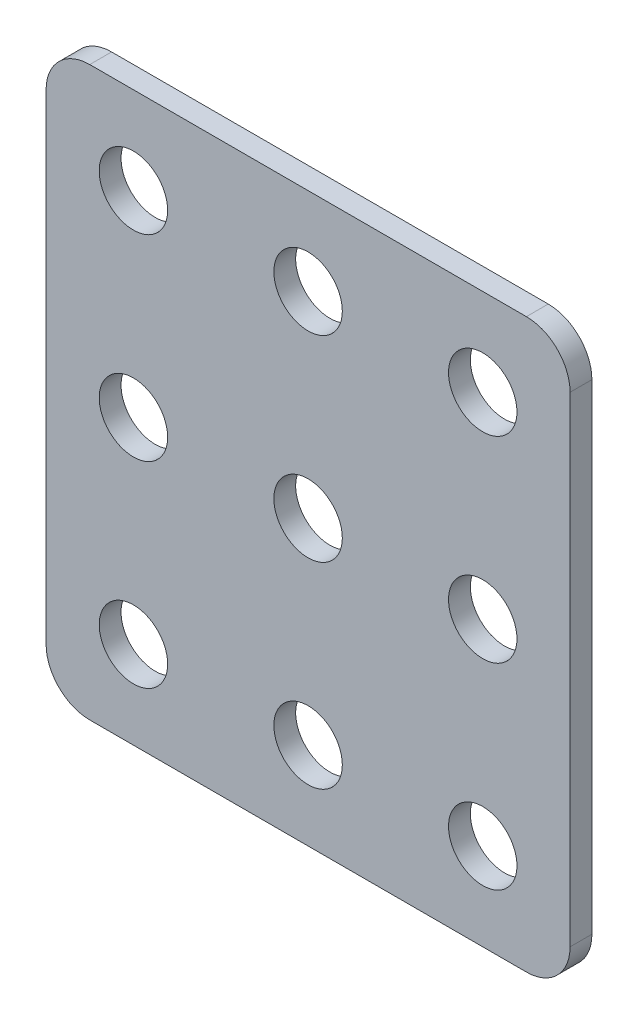
ISO-10303-21;
HEADER;
FILE_DESCRIPTION(('STEP AP214'),'2;1');
FILE_NAME('part.step','',(''),(''),'','','');
FILE_SCHEMA(('AUTOMOTIVE_DESIGN { 1 0 10303 214 1 1 1 1 }'));
ENDSEC;
DATA;
#1=APPLICATION_CONTEXT('core data for automotive mechanical design processes');
#2=APPLICATION_PROTOCOL_DEFINITION('international standard','automotive_design',2000,#1);
#3=PRODUCT_CONTEXT('',#1,'mechanical');
#4=PRODUCT('Part','Part','',(#3));
#5=PRODUCT_RELATED_PRODUCT_CATEGORY('part','',(#4));
#6=PRODUCT_DEFINITION_FORMATION('','',#4);
#7=PRODUCT_DEFINITION_CONTEXT('part definition',#1,'design');
#8=PRODUCT_DEFINITION('design','',#6,#7);
#9=PRODUCT_DEFINITION_SHAPE('','',#8);
#10=(LENGTH_UNIT() NAMED_UNIT(*) SI_UNIT(.MILLI.,.METRE.));
#11=(NAMED_UNIT(*) PLANE_ANGLE_UNIT() SI_UNIT($,.RADIAN.));
#12=(NAMED_UNIT(*) SI_UNIT($,.STERADIAN.) SOLID_ANGLE_UNIT());
#13=UNCERTAINTY_MEASURE_WITH_UNIT(LENGTH_MEASURE(1.E-05),#10,'distance_accuracy_value','');
#14=(GEOMETRIC_REPRESENTATION_CONTEXT(3) GLOBAL_UNCERTAINTY_ASSIGNED_CONTEXT((#13)) GLOBAL_UNIT_ASSIGNED_CONTEXT((#10,
#11,#12)) REPRESENTATION_CONTEXT('',''));
#15=CARTESIAN_POINT('',(0.,0.,0.));
#16=DIRECTION('',(0.,0.,1.));
#17=DIRECTION('',(1.,0.,0.));
#18=AXIS2_PLACEMENT_3D('',#15,#16,#17);
#19=CARTESIAN_POINT('',(31.75,34.925,0.79375));
#20=DIRECTION('',(0.,0.,-1.));
#21=DIRECTION('',(-1.,0.,0.));
#22=AXIS2_PLACEMENT_3D('',#19,#20,#21);
#23=CYLINDRICAL_SURFACE('',#22,2.4892);
#24=CARTESIAN_POINT('',(31.75,34.925,0.79375));
#25=DIRECTION('',(0.,0.,1.));
#26=DIRECTION('',(1.,0.,0.));
#27=AXIS2_PLACEMENT_3D('',#24,#25,#26);
#28=CIRCLE('',#27,2.4892);
#29=CARTESIAN_POINT('',(34.2392,34.925,0.79375));
#30=VERTEX_POINT('',#29);
#31=EDGE_CURVE('E185',#30,#30,#28,.T.);
#32=ORIENTED_EDGE('',*,*,#31,.T.);
#33=EDGE_LOOP('',(#32));
#34=FACE_BOUND('',#33,.T.);
#35=CARTESIAN_POINT('',(31.75,34.925,-0.79375));
#36=DIRECTION('',(0.,0.,1.));
#37=DIRECTION('',(1.,0.,0.));
#38=AXIS2_PLACEMENT_3D('',#35,#36,#37);
#39=CIRCLE('',#38,2.4892);
#40=CARTESIAN_POINT('',(34.2392,34.925,-0.79375));
#41=VERTEX_POINT('',#40);
#42=EDGE_CURVE('E188',#41,#41,#39,.T.);
#43=ORIENTED_EDGE('',*,*,#42,.F.);
#44=EDGE_LOOP('',(#43));
#45=FACE_BOUND('',#44,.T.);
#46=ADVANCED_FACE('F33',(#34,#45),#23,.F.);
#47=CARTESIAN_POINT('',(31.75,20.6375,0.79375));
#48=DIRECTION('',(0.,0.,-1.));
#49=DIRECTION('',(-1.,0.,0.));
#50=AXIS2_PLACEMENT_3D('',#47,#48,#49);
#51=CYLINDRICAL_SURFACE('',#50,2.4892);
#52=CARTESIAN_POINT('',(31.75,20.6375,0.79375));
#53=DIRECTION('',(0.,0.,1.));
#54=DIRECTION('',(1.,0.,0.));
#55=AXIS2_PLACEMENT_3D('',#52,#53,#54);
#56=CIRCLE('',#55,2.4892);
#57=CARTESIAN_POINT('',(34.2392,20.6375,0.79375));
#58=VERTEX_POINT('',#57);
#59=EDGE_CURVE('E179',#58,#58,#56,.T.);
#60=ORIENTED_EDGE('',*,*,#59,.T.);
#61=EDGE_LOOP('',(#60));
#62=FACE_BOUND('',#61,.T.);
#63=CARTESIAN_POINT('',(31.75,20.6375,-0.79375));
#64=DIRECTION('',(0.,0.,1.));
#65=DIRECTION('',(1.,0.,0.));
#66=AXIS2_PLACEMENT_3D('',#63,#64,#65);
#67=CIRCLE('',#66,2.4892);
#68=CARTESIAN_POINT('',(34.2392,20.6375,-0.79375));
#69=VERTEX_POINT('',#68);
#70=EDGE_CURVE('E182',#69,#69,#67,.T.);
#71=ORIENTED_EDGE('',*,*,#70,.F.);
#72=EDGE_LOOP('',(#71));
#73=FACE_BOUND('',#72,.T.);
#74=ADVANCED_FACE('F245',(#62,#73),#51,.F.);
#75=CARTESIAN_POINT('',(31.75,6.35,0.79375));
#76=DIRECTION('',(0.,0.,-1.));
#77=DIRECTION('',(-1.,0.,0.));
#78=AXIS2_PLACEMENT_3D('',#75,#76,#77);
#79=CYLINDRICAL_SURFACE('',#78,2.4892);
#80=CARTESIAN_POINT('',(31.75,6.35,0.79375));
#81=DIRECTION('',(0.,0.,1.));
#82=DIRECTION('',(1.,0.,0.));
#83=AXIS2_PLACEMENT_3D('',#80,#81,#82);
#84=CIRCLE('',#83,2.4892);
#85=CARTESIAN_POINT('',(34.2392,6.35,0.79375));
#86=VERTEX_POINT('',#85);
#87=EDGE_CURVE('E173',#86,#86,#84,.T.);
#88=ORIENTED_EDGE('',*,*,#87,.T.);
#89=EDGE_LOOP('',(#88));
#90=FACE_BOUND('',#89,.T.);
#91=CARTESIAN_POINT('',(31.75,6.35,-0.79375));
#92=DIRECTION('',(0.,0.,1.));
#93=DIRECTION('',(1.,0.,0.));
#94=AXIS2_PLACEMENT_3D('',#91,#92,#93);
#95=CIRCLE('',#94,2.4892);
#96=CARTESIAN_POINT('',(34.2392,6.35,-0.79375));
#97=VERTEX_POINT('',#96);
#98=EDGE_CURVE('E176',#97,#97,#95,.T.);
#99=ORIENTED_EDGE('',*,*,#98,.F.);
#100=EDGE_LOOP('',(#99));
#101=FACE_BOUND('',#100,.T.);
#102=ADVANCED_FACE('F251',(#90,#101),#79,.F.);
#103=CARTESIAN_POINT('',(19.05,34.925,0.79375));
#104=DIRECTION('',(0.,0.,-1.));
#105=DIRECTION('',(-1.,0.,0.));
#106=AXIS2_PLACEMENT_3D('',#103,#104,#105);
#107=CYLINDRICAL_SURFACE('',#106,2.4892);
#108=CARTESIAN_POINT('',(19.05,34.925,0.79375));
#109=DIRECTION('',(0.,0.,1.));
#110=DIRECTION('',(1.,0.,0.));
#111=AXIS2_PLACEMENT_3D('',#108,#109,#110);
#112=CIRCLE('',#111,2.4892);
#113=CARTESIAN_POINT('',(21.5392,34.925,0.79375));
#114=VERTEX_POINT('',#113);
#115=EDGE_CURVE('E167',#114,#114,#112,.T.);
#116=ORIENTED_EDGE('',*,*,#115,.T.);
#117=EDGE_LOOP('',(#116));
#118=FACE_BOUND('',#117,.T.);
#119=CARTESIAN_POINT('',(19.05,34.925,-0.79375));
#120=DIRECTION('',(0.,0.,1.));
#121=DIRECTION('',(1.,0.,0.));
#122=AXIS2_PLACEMENT_3D('',#119,#120,#121);
#123=CIRCLE('',#122,2.4892);
#124=CARTESIAN_POINT('',(21.5392,34.925,-0.79375));
#125=VERTEX_POINT('',#124);
#126=EDGE_CURVE('E170',#125,#125,#123,.T.);
#127=ORIENTED_EDGE('',*,*,#126,.F.);
#128=EDGE_LOOP('',(#127));
#129=FACE_BOUND('',#128,.T.);
#130=ADVANCED_FACE('F300',(#118,#129),#107,.F.);
#131=CARTESIAN_POINT('',(19.05,20.6375,0.79375));
#132=DIRECTION('',(0.,0.,-1.));
#133=DIRECTION('',(-1.,0.,0.));
#134=AXIS2_PLACEMENT_3D('',#131,#132,#133);
#135=CYLINDRICAL_SURFACE('',#134,2.4892);
#136=CARTESIAN_POINT('',(19.05,20.6375,0.79375));
#137=DIRECTION('',(0.,0.,1.));
#138=DIRECTION('',(1.,0.,0.));
#139=AXIS2_PLACEMENT_3D('',#136,#137,#138);
#140=CIRCLE('',#139,2.4892);
#141=CARTESIAN_POINT('',(21.5392,20.6375,0.79375));
#142=VERTEX_POINT('',#141);
#143=EDGE_CURVE('E161',#142,#142,#140,.T.);
#144=ORIENTED_EDGE('',*,*,#143,.T.);
#145=EDGE_LOOP('',(#144));
#146=FACE_BOUND('',#145,.T.);
#147=CARTESIAN_POINT('',(19.05,20.6375,-0.79375));
#148=DIRECTION('',(0.,0.,1.));
#149=DIRECTION('',(1.,0.,0.));
#150=AXIS2_PLACEMENT_3D('',#147,#148,#149);
#151=CIRCLE('',#150,2.4892);
#152=CARTESIAN_POINT('',(21.5392,20.6375,-0.79375));
#153=VERTEX_POINT('',#152);
#154=EDGE_CURVE('E164',#153,#153,#151,.T.);
#155=ORIENTED_EDGE('',*,*,#154,.F.);
#156=EDGE_LOOP('',(#155));
#157=FACE_BOUND('',#156,.T.);
#158=ADVANCED_FACE('F296',(#146,#157),#135,.F.);
#159=CARTESIAN_POINT('',(19.05,6.35,0.79375));
#160=DIRECTION('',(0.,0.,-1.));
#161=DIRECTION('',(-1.,0.,0.));
#162=AXIS2_PLACEMENT_3D('',#159,#160,#161);
#163=CYLINDRICAL_SURFACE('',#162,2.4892);
#164=CARTESIAN_POINT('',(19.05,6.35,0.79375));
#165=DIRECTION('',(0.,0.,1.));
#166=DIRECTION('',(1.,0.,0.));
#167=AXIS2_PLACEMENT_3D('',#164,#165,#166);
#168=CIRCLE('',#167,2.4892);
#169=CARTESIAN_POINT('',(21.5392,6.35,0.79375));
#170=VERTEX_POINT('',#169);
#171=EDGE_CURVE('E155',#170,#170,#168,.T.);
#172=ORIENTED_EDGE('',*,*,#171,.T.);
#173=EDGE_LOOP('',(#172));
#174=FACE_BOUND('',#173,.T.);
#175=CARTESIAN_POINT('',(19.05,6.35,-0.79375));
#176=DIRECTION('',(0.,0.,1.));
#177=DIRECTION('',(1.,0.,0.));
#178=AXIS2_PLACEMENT_3D('',#175,#176,#177);
#179=CIRCLE('',#178,2.4892);
#180=CARTESIAN_POINT('',(21.5392,6.35,-0.79375));
#181=VERTEX_POINT('',#180);
#182=EDGE_CURVE('E158',#181,#181,#179,.T.);
#183=ORIENTED_EDGE('',*,*,#182,.F.);
#184=EDGE_LOOP('',(#183));
#185=FACE_BOUND('',#184,.T.);
#186=ADVANCED_FACE('F292',(#174,#185),#163,.F.);
#187=CARTESIAN_POINT('',(6.35,34.925,0.79375));
#188=DIRECTION('',(0.,0.,-1.));
#189=DIRECTION('',(-1.,0.,0.));
#190=AXIS2_PLACEMENT_3D('',#187,#188,#189);
#191=CYLINDRICAL_SURFACE('',#190,2.4892);
#192=CARTESIAN_POINT('',(6.35,34.925,0.79375));
#193=DIRECTION('',(0.,0.,1.));
#194=DIRECTION('',(1.,0.,0.));
#195=AXIS2_PLACEMENT_3D('',#192,#193,#194);
#196=CIRCLE('',#195,2.4892);
#197=CARTESIAN_POINT('',(8.8392,34.925,0.79375));
#198=VERTEX_POINT('',#197);
#199=EDGE_CURVE('E149',#198,#198,#196,.T.);
#200=ORIENTED_EDGE('',*,*,#199,.T.);
#201=EDGE_LOOP('',(#200));
#202=FACE_BOUND('',#201,.T.);
#203=CARTESIAN_POINT('',(6.35,34.925,-0.79375));
#204=DIRECTION('',(0.,0.,1.));
#205=DIRECTION('',(1.,0.,0.));
#206=AXIS2_PLACEMENT_3D('',#203,#204,#205);
#207=CIRCLE('',#206,2.4892);
#208=CARTESIAN_POINT('',(8.8392,34.925,-0.79375));
#209=VERTEX_POINT('',#208);
#210=EDGE_CURVE('E152',#209,#209,#207,.T.);
#211=ORIENTED_EDGE('',*,*,#210,.F.);
#212=EDGE_LOOP('',(#211));
#213=FACE_BOUND('',#212,.T.);
#214=ADVANCED_FACE('F278',(#202,#213),#191,.F.);
#215=CARTESIAN_POINT('',(6.35,20.6375,0.79375));
#216=DIRECTION('',(0.,0.,-1.));
#217=DIRECTION('',(-1.,0.,0.));
#218=AXIS2_PLACEMENT_3D('',#215,#216,#217);
#219=CYLINDRICAL_SURFACE('',#218,2.4892);
#220=CARTESIAN_POINT('',(6.35,20.6375,0.79375));
#221=DIRECTION('',(0.,0.,1.));
#222=DIRECTION('',(1.,0.,0.));
#223=AXIS2_PLACEMENT_3D('',#220,#221,#222);
#224=CIRCLE('',#223,2.4892);
#225=CARTESIAN_POINT('',(8.8392,20.6375,0.79375));
#226=VERTEX_POINT('',#225);
#227=EDGE_CURVE('E143',#226,#226,#224,.T.);
#228=ORIENTED_EDGE('',*,*,#227,.T.);
#229=EDGE_LOOP('',(#228));
#230=FACE_BOUND('',#229,.T.);
#231=CARTESIAN_POINT('',(6.35,20.6375,-0.79375));
#232=DIRECTION('',(0.,0.,1.));
#233=DIRECTION('',(1.,0.,0.));
#234=AXIS2_PLACEMENT_3D('',#231,#232,#233);
#235=CIRCLE('',#234,2.4892);
#236=CARTESIAN_POINT('',(8.8392,20.6375,-0.79375));
#237=VERTEX_POINT('',#236);
#238=EDGE_CURVE('E146',#237,#237,#235,.T.);
#239=ORIENTED_EDGE('',*,*,#238,.F.);
#240=EDGE_LOOP('',(#239));
#241=FACE_BOUND('',#240,.T.);
#242=ADVANCED_FACE('F269',(#230,#241),#219,.F.);
#243=CARTESIAN_POINT('',(0.,0.,0.79375));
#244=DIRECTION('',(0.,0.,-1.));
#245=DIRECTION('',(-1.,0.,0.));
#246=AXIS2_PLACEMENT_3D('',#243,#244,#245);
#247=PLANE('',#246);
#248=ORIENTED_EDGE('',*,*,#31,.F.);
#249=EDGE_LOOP('',(#248));
#250=FACE_BOUND('',#249,.T.);
#251=ORIENTED_EDGE('',*,*,#59,.F.);
#252=EDGE_LOOP('',(#251));
#253=FACE_BOUND('',#252,.T.);
#254=ORIENTED_EDGE('',*,*,#87,.F.);
#255=EDGE_LOOP('',(#254));
#256=FACE_BOUND('',#255,.T.);
#257=ORIENTED_EDGE('',*,*,#115,.F.);
#258=EDGE_LOOP('',(#257));
#259=FACE_BOUND('',#258,.T.);
#260=ORIENTED_EDGE('',*,*,#143,.F.);
#261=EDGE_LOOP('',(#260));
#262=FACE_BOUND('',#261,.T.);
#263=ORIENTED_EDGE('',*,*,#171,.F.);
#264=EDGE_LOOP('',(#263));
#265=FACE_BOUND('',#264,.T.);
#266=ORIENTED_EDGE('',*,*,#199,.F.);
#267=EDGE_LOOP('',(#266));
#268=FACE_BOUND('',#267,.T.);
#269=ORIENTED_EDGE('',*,*,#227,.F.);
#270=EDGE_LOOP('',(#269));
#271=FACE_BOUND('',#270,.T.);
#272=DIRECTION('',(-1.,0.,0.));
#273=VECTOR('',#272,1.);
#274=CARTESIAN_POINT('',(0.,41.275,0.79375));
#275=LINE('',#274,#273);
#276=CARTESIAN_POINT('',(34.925,41.275,0.79375));
#277=VERTEX_POINT('',#276);
#278=CARTESIAN_POINT('',(3.175,41.275,0.79375));
#279=VERTEX_POINT('',#278);
#280=EDGE_CURVE('E137',#277,#279,#275,.T.);
#281=ORIENTED_EDGE('',*,*,#280,.T.);
#282=CARTESIAN_POINT('',(3.175,38.1,0.79375));
#283=DIRECTION('',(0.,0.,-1.));
#284=DIRECTION('',(-1.,0.,0.));
#285=AXIS2_PLACEMENT_3D('',#282,#283,#284);
#286=CIRCLE('',#285,3.175);
#287=CARTESIAN_POINT('',(0.,38.1,0.79375));
#288=VERTEX_POINT('',#287);
#289=EDGE_CURVE('E203',#279,#288,#286,.F.);
#290=ORIENTED_EDGE('',*,*,#289,.T.);
#291=DIRECTION('',(0.,-1.,0.));
#292=VECTOR('',#291,1.);
#293=CARTESIAN_POINT('',(0.,0.,0.79375));
#294=LINE('',#293,#292);
#295=CARTESIAN_POINT('',(0.,3.175,0.79375));
#296=VERTEX_POINT('',#295);
#297=EDGE_CURVE('E119',#288,#296,#294,.T.);
#298=ORIENTED_EDGE('',*,*,#297,.T.);
#299=CARTESIAN_POINT('',(3.175,3.175,0.79375));
#300=DIRECTION('',(0.,0.,-1.));
#301=DIRECTION('',(-1.,0.,0.));
#302=AXIS2_PLACEMENT_3D('',#299,#300,#301);
#303=CIRCLE('',#302,3.175);
#304=CARTESIAN_POINT('',(3.175,0.,0.79375));
#305=VERTEX_POINT('',#304);
#306=EDGE_CURVE('E200',#296,#305,#303,.F.);
#307=ORIENTED_EDGE('',*,*,#306,.T.);
#308=DIRECTION('',(1.,0.,0.));
#309=VECTOR('',#308,1.);
#310=CARTESIAN_POINT('',(0.,0.,0.79375));
#311=LINE('',#310,#309);
#312=CARTESIAN_POINT('',(34.925,0.,0.79375));
#313=VERTEX_POINT('',#312);
#314=EDGE_CURVE('E214',#305,#313,#311,.T.);
#315=ORIENTED_EDGE('',*,*,#314,.T.);
#316=CARTESIAN_POINT('',(34.925,3.175,0.79375));
#317=DIRECTION('',(0.,0.,-1.));
#318=DIRECTION('',(-1.,0.,0.));
#319=AXIS2_PLACEMENT_3D('',#316,#317,#318);
#320=CIRCLE('',#319,3.175);
#321=CARTESIAN_POINT('',(38.1,3.175,0.79375));
#322=VERTEX_POINT('',#321);
#323=EDGE_CURVE('E55',#313,#322,#320,.F.);
#324=ORIENTED_EDGE('',*,*,#323,.T.);
#325=DIRECTION('',(0.,1.,0.));
#326=VECTOR('',#325,1.);
#327=CARTESIAN_POINT('',(38.1,0.,0.79375));
#328=LINE('',#327,#326);
#329=CARTESIAN_POINT('',(38.1,38.1,0.79375));
#330=VERTEX_POINT('',#329);
#331=EDGE_CURVE('E222',#322,#330,#328,.T.);
#332=ORIENTED_EDGE('',*,*,#331,.T.);
#333=CARTESIAN_POINT('',(34.925,38.1,0.79375));
#334=DIRECTION('',(0.,0.,-1.));
#335=DIRECTION('',(-1.,0.,0.));
#336=AXIS2_PLACEMENT_3D('',#333,#334,#335);
#337=CIRCLE('',#336,3.175);
#338=EDGE_CURVE('E198',#330,#277,#337,.F.);
#339=ORIENTED_EDGE('',*,*,#338,.T.);
#340=EDGE_LOOP('',(#281,#290,#298,#307,#315,#324,#332,#339));
#341=FACE_BOUND('',#340,.T.);
#342=CARTESIAN_POINT('',(6.35,6.35,0.79375));
#343=DIRECTION('',(0.,0.,1.));
#344=DIRECTION('',(1.,0.,0.));
#345=AXIS2_PLACEMENT_3D('',#342,#343,#344);
#346=CIRCLE('',#345,2.4892);
#347=CARTESIAN_POINT('',(8.8392,6.35,0.79375));
#348=VERTEX_POINT('',#347);
#349=EDGE_CURVE('E128',#348,#348,#346,.T.);
#350=ORIENTED_EDGE('',*,*,#349,.F.);
#351=EDGE_LOOP('',(#350));
#352=FACE_BOUND('',#351,.T.);
#353=ADVANCED_FACE('F264',(#250,#253,#256,#259,#262,#265,#268,#271,#341,#352),#247,.F.);
#354=CARTESIAN_POINT('',(0.,0.,-0.79375));
#355=DIRECTION('',(0.,0.,-1.));
#356=DIRECTION('',(-1.,0.,0.));
#357=AXIS2_PLACEMENT_3D('',#354,#355,#356);
#358=PLANE('',#357);
#359=ORIENTED_EDGE('',*,*,#42,.T.);
#360=EDGE_LOOP('',(#359));
#361=FACE_BOUND('',#360,.T.);
#362=ORIENTED_EDGE('',*,*,#70,.T.);
#363=EDGE_LOOP('',(#362));
#364=FACE_BOUND('',#363,.T.);
#365=ORIENTED_EDGE('',*,*,#98,.T.);
#366=EDGE_LOOP('',(#365));
#367=FACE_BOUND('',#366,.T.);
#368=ORIENTED_EDGE('',*,*,#126,.T.);
#369=EDGE_LOOP('',(#368));
#370=FACE_BOUND('',#369,.T.);
#371=ORIENTED_EDGE('',*,*,#154,.T.);
#372=EDGE_LOOP('',(#371));
#373=FACE_BOUND('',#372,.T.);
#374=ORIENTED_EDGE('',*,*,#182,.T.);
#375=EDGE_LOOP('',(#374));
#376=FACE_BOUND('',#375,.T.);
#377=ORIENTED_EDGE('',*,*,#210,.T.);
#378=EDGE_LOOP('',(#377));
#379=FACE_BOUND('',#378,.T.);
#380=ORIENTED_EDGE('',*,*,#238,.T.);
#381=EDGE_LOOP('',(#380));
#382=FACE_BOUND('',#381,.T.);
#383=DIRECTION('',(0.,-1.,0.));
#384=VECTOR('',#383,1.);
#385=CARTESIAN_POINT('',(0.,0.,-0.79375));
#386=LINE('',#385,#384);
#387=CARTESIAN_POINT('',(0.,38.1,-0.79375));
#388=VERTEX_POINT('',#387);
#389=CARTESIAN_POINT('',(0.,3.175,-0.79375));
#390=VERTEX_POINT('',#389);
#391=EDGE_CURVE('E116',#388,#390,#386,.T.);
#392=ORIENTED_EDGE('',*,*,#391,.F.);
#393=CARTESIAN_POINT('',(3.175,38.1,-0.79375));
#394=DIRECTION('',(0.,0.,-1.));
#395=DIRECTION('',(-1.,0.,0.));
#396=AXIS2_PLACEMENT_3D('',#393,#394,#395);
#397=CIRCLE('',#396,3.175);
#398=CARTESIAN_POINT('',(3.175,41.275,-0.79375));
#399=VERTEX_POINT('',#398);
#400=EDGE_CURVE('E99',#388,#399,#397,.T.);
#401=ORIENTED_EDGE('',*,*,#400,.T.);
#402=DIRECTION('',(-1.,0.,0.));
#403=VECTOR('',#402,1.);
#404=CARTESIAN_POINT('',(0.,41.275,-0.79375));
#405=LINE('',#404,#403);
#406=CARTESIAN_POINT('',(34.925,41.275,-0.79375));
#407=VERTEX_POINT('',#406);
#408=EDGE_CURVE('E141',#407,#399,#405,.T.);
#409=ORIENTED_EDGE('',*,*,#408,.F.);
#410=CARTESIAN_POINT('',(34.925,38.1,-0.79375));
#411=DIRECTION('',(0.,0.,-1.));
#412=DIRECTION('',(-1.,0.,0.));
#413=AXIS2_PLACEMENT_3D('',#410,#411,#412);
#414=CIRCLE('',#413,3.175);
#415=CARTESIAN_POINT('',(38.1,38.1,-0.79375));
#416=VERTEX_POINT('',#415);
#417=EDGE_CURVE('E120',#407,#416,#414,.T.);
#418=ORIENTED_EDGE('',*,*,#417,.T.);
#419=DIRECTION('',(0.,1.,0.));
#420=VECTOR('',#419,1.);
#421=CARTESIAN_POINT('',(38.1,0.,-0.79375));
#422=LINE('',#421,#420);
#423=CARTESIAN_POINT('',(38.1,3.175,-0.79375));
#424=VERTEX_POINT('',#423);
#425=EDGE_CURVE('E131',#424,#416,#422,.T.);
#426=ORIENTED_EDGE('',*,*,#425,.F.);
#427=CARTESIAN_POINT('',(34.925,3.175,-0.79375));
#428=DIRECTION('',(0.,0.,-1.));
#429=DIRECTION('',(-1.,0.,0.));
#430=AXIS2_PLACEMENT_3D('',#427,#428,#429);
#431=CIRCLE('',#430,3.175);
#432=CARTESIAN_POINT('',(34.925,0.,-0.79375));
#433=VERTEX_POINT('',#432);
#434=EDGE_CURVE('E110',#424,#433,#431,.T.);
#435=ORIENTED_EDGE('',*,*,#434,.T.);
#436=DIRECTION('',(1.,0.,0.));
#437=VECTOR('',#436,1.);
#438=CARTESIAN_POINT('',(0.,0.,-0.79375));
#439=LINE('',#438,#437);
#440=CARTESIAN_POINT('',(3.175,0.,-0.79375));
#441=VERTEX_POINT('',#440);
#442=EDGE_CURVE('E127',#441,#433,#439,.T.);
#443=ORIENTED_EDGE('',*,*,#442,.F.);
#444=CARTESIAN_POINT('',(3.175,3.175,-0.79375));
#445=DIRECTION('',(0.,0.,-1.));
#446=DIRECTION('',(-1.,0.,0.));
#447=AXIS2_PLACEMENT_3D('',#444,#445,#446);
#448=CIRCLE('',#447,3.175);
#449=EDGE_CURVE('E126',#441,#390,#448,.T.);
#450=ORIENTED_EDGE('',*,*,#449,.T.);
#451=EDGE_LOOP('',(#392,#401,#409,#418,#426,#435,#443,#450));
#452=FACE_BOUND('',#451,.T.);
#453=CARTESIAN_POINT('',(6.35,6.35,-0.79375));
#454=DIRECTION('',(0.,0.,1.));
#455=DIRECTION('',(1.,0.,0.));
#456=AXIS2_PLACEMENT_3D('',#453,#454,#455);
#457=CIRCLE('',#456,2.4892);
#458=CARTESIAN_POINT('',(8.8392,6.35,-0.79375));
#459=VERTEX_POINT('',#458);
#460=EDGE_CURVE('E134',#459,#459,#457,.T.);
#461=ORIENTED_EDGE('',*,*,#460,.T.);
#462=EDGE_LOOP('',(#461));
#463=FACE_BOUND('',#462,.T.);
#464=ADVANCED_FACE('F123',(#361,#364,#367,#370,#373,#376,#379,#382,#452,#463),#358,.T.);
#465=CARTESIAN_POINT('',(0.,0.,0.79375));
#466=DIRECTION('',(1.,0.,0.));
#467=DIRECTION('',(0.,0.,-1.));
#468=AXIS2_PLACEMENT_3D('',#465,#466,#467);
#469=PLANE('',#468);
#470=ORIENTED_EDGE('',*,*,#297,.F.);
#471=DIRECTION('',(0.,0.,-1.));
#472=VECTOR('',#471,1.);
#473=CARTESIAN_POINT('',(0.,38.1,0.79375));
#474=LINE('',#473,#472);
#475=EDGE_CURVE('E103',#288,#388,#474,.T.);
#476=ORIENTED_EDGE('',*,*,#475,.T.);
#477=ORIENTED_EDGE('',*,*,#391,.T.);
#478=DIRECTION('',(0.,0.,-1.));
#479=VECTOR('',#478,1.);
#480=CARTESIAN_POINT('',(0.,3.175,0.79375));
#481=LINE('',#480,#479);
#482=EDGE_CURVE('E121',#390,#296,#481,.F.);
#483=ORIENTED_EDGE('',*,*,#482,.T.);
#484=EDGE_LOOP('',(#470,#476,#477,#483));
#485=FACE_BOUND('',#484,.T.);
#486=ADVANCED_FACE('F115',(#485),#469,.F.);
#487=CARTESIAN_POINT('',(0.,0.,0.79375));
#488=DIRECTION('',(0.,1.,0.));
#489=DIRECTION('',(0.,0.,1.));
#490=AXIS2_PLACEMENT_3D('',#487,#488,#489);
#491=PLANE('',#490);
#492=ORIENTED_EDGE('',*,*,#442,.T.);
#493=DIRECTION('',(0.,0.,-1.));
#494=VECTOR('',#493,1.);
#495=CARTESIAN_POINT('',(34.925,0.,0.79375));
#496=LINE('',#495,#494);
#497=EDGE_CURVE('E11',#433,#313,#496,.F.);
#498=ORIENTED_EDGE('',*,*,#497,.T.);
#499=ORIENTED_EDGE('',*,*,#314,.F.);
#500=DIRECTION('',(0.,0.,-1.));
#501=VECTOR('',#500,1.);
#502=CARTESIAN_POINT('',(3.175,0.,0.79375));
#503=LINE('',#502,#501);
#504=EDGE_CURVE('E41',#305,#441,#503,.T.);
#505=ORIENTED_EDGE('',*,*,#504,.T.);
#506=EDGE_LOOP('',(#492,#498,#499,#505));
#507=FACE_BOUND('',#506,.T.);
#508=ADVANCED_FACE('F212',(#507),#491,.F.);
#509=CARTESIAN_POINT('',(38.1,0.,0.79375));
#510=DIRECTION('',(-1.,0.,0.));
#511=DIRECTION('',(0.,0.,1.));
#512=AXIS2_PLACEMENT_3D('',#509,#510,#511);
#513=PLANE('',#512);
#514=ORIENTED_EDGE('',*,*,#331,.F.);
#515=DIRECTION('',(0.,0.,-1.));
#516=VECTOR('',#515,1.);
#517=CARTESIAN_POINT('',(38.1,3.175,0.79375));
#518=LINE('',#517,#516);
#519=EDGE_CURVE('E206',#322,#424,#518,.T.);
#520=ORIENTED_EDGE('',*,*,#519,.T.);
#521=ORIENTED_EDGE('',*,*,#425,.T.);
#522=DIRECTION('',(0.,0.,-1.));
#523=VECTOR('',#522,1.);
#524=CARTESIAN_POINT('',(38.1,38.1,0.79375));
#525=LINE('',#524,#523);
#526=EDGE_CURVE('E48',#416,#330,#525,.F.);
#527=ORIENTED_EDGE('',*,*,#526,.T.);
#528=EDGE_LOOP('',(#514,#520,#521,#527));
#529=FACE_BOUND('',#528,.T.);
#530=ADVANCED_FACE('F221',(#529),#513,.F.);
#531=CARTESIAN_POINT('',(0.,41.275,0.79375));
#532=DIRECTION('',(0.,-1.,0.));
#533=DIRECTION('',(0.,0.,-1.));
#534=AXIS2_PLACEMENT_3D('',#531,#532,#533);
#535=PLANE('',#534);
#536=ORIENTED_EDGE('',*,*,#408,.T.);
#537=DIRECTION('',(0.,0.,-1.));
#538=VECTOR('',#537,1.);
#539=CARTESIAN_POINT('',(3.175,41.275,0.79375));
#540=LINE('',#539,#538);
#541=EDGE_CURVE('E104',#399,#279,#540,.F.);
#542=ORIENTED_EDGE('',*,*,#541,.T.);
#543=ORIENTED_EDGE('',*,*,#280,.F.);
#544=DIRECTION('',(0.,0.,-1.));
#545=VECTOR('',#544,1.);
#546=CARTESIAN_POINT('',(34.925,41.275,0.79375));
#547=LINE('',#546,#545);
#548=EDGE_CURVE('E109',#277,#407,#547,.T.);
#549=ORIENTED_EDGE('',*,*,#548,.T.);
#550=EDGE_LOOP('',(#536,#542,#543,#549));
#551=FACE_BOUND('',#550,.T.);
#552=ADVANCED_FACE('F233',(#551),#535,.F.);
#553=CARTESIAN_POINT('',(6.35,6.35,0.79375));
#554=DIRECTION('',(0.,0.,-1.));
#555=DIRECTION('',(-1.,0.,0.));
#556=AXIS2_PLACEMENT_3D('',#553,#554,#555);
#557=CYLINDRICAL_SURFACE('',#556,2.4892);
#558=ORIENTED_EDGE('',*,*,#349,.T.);
#559=EDGE_LOOP('',(#558));
#560=FACE_BOUND('',#559,.T.);
#561=ORIENTED_EDGE('',*,*,#460,.F.);
#562=EDGE_LOOP('',(#561));
#563=FACE_BOUND('',#562,.T.);
#564=ADVANCED_FACE('F231',(#560,#563),#557,.F.);
#565=CARTESIAN_POINT('',(3.175,38.1,0.79375));
#566=DIRECTION('',(0.,0.,-1.));
#567=DIRECTION('',(-1.,0.,0.));
#568=AXIS2_PLACEMENT_3D('',#565,#566,#567);
#569=CYLINDRICAL_SURFACE('',#568,3.175);
#570=ORIENTED_EDGE('',*,*,#289,.F.);
#571=ORIENTED_EDGE('',*,*,#541,.F.);
#572=ORIENTED_EDGE('',*,*,#400,.F.);
#573=ORIENTED_EDGE('',*,*,#475,.F.);
#574=EDGE_LOOP('',(#570,#571,#572,#573));
#575=FACE_BOUND('',#574,.T.);
#576=ADVANCED_FACE('F102',(#575),#569,.T.);
#577=CARTESIAN_POINT('',(34.925,3.175,0.79375));
#578=DIRECTION('',(0.,0.,-1.));
#579=DIRECTION('',(-1.,0.,0.));
#580=AXIS2_PLACEMENT_3D('',#577,#578,#579);
#581=CYLINDRICAL_SURFACE('',#580,3.175);
#582=ORIENTED_EDGE('',*,*,#323,.F.);
#583=ORIENTED_EDGE('',*,*,#497,.F.);
#584=ORIENTED_EDGE('',*,*,#434,.F.);
#585=ORIENTED_EDGE('',*,*,#519,.F.);
#586=EDGE_LOOP('',(#582,#583,#584,#585));
#587=FACE_BOUND('',#586,.T.);
#588=ADVANCED_FACE('F220',(#587),#581,.T.);
#589=CARTESIAN_POINT('',(3.175,3.175,0.79375));
#590=DIRECTION('',(0.,0.,-1.));
#591=DIRECTION('',(-1.,0.,0.));
#592=AXIS2_PLACEMENT_3D('',#589,#590,#591);
#593=CYLINDRICAL_SURFACE('',#592,3.175);
#594=ORIENTED_EDGE('',*,*,#306,.F.);
#595=ORIENTED_EDGE('',*,*,#482,.F.);
#596=ORIENTED_EDGE('',*,*,#449,.F.);
#597=ORIENTED_EDGE('',*,*,#504,.F.);
#598=EDGE_LOOP('',(#594,#595,#596,#597));
#599=FACE_BOUND('',#598,.T.);
#600=ADVANCED_FACE('F258',(#599),#593,.T.);
#601=CARTESIAN_POINT('',(34.925,38.1,0.79375));
#602=DIRECTION('',(0.,0.,-1.));
#603=DIRECTION('',(-1.,0.,0.));
#604=AXIS2_PLACEMENT_3D('',#601,#602,#603);
#605=CYLINDRICAL_SURFACE('',#604,3.175);
#606=ORIENTED_EDGE('',*,*,#338,.F.);
#607=ORIENTED_EDGE('',*,*,#526,.F.);
#608=ORIENTED_EDGE('',*,*,#417,.F.);
#609=ORIENTED_EDGE('',*,*,#548,.F.);
#610=EDGE_LOOP('',(#606,#607,#608,#609));
#611=FACE_BOUND('',#610,.T.);
#612=ADVANCED_FACE('F35',(#611),#605,.T.);
#613=CLOSED_SHELL('',(#46,#74,#102,#130,#158,#186,#214,#242,#353,#464,#486,#508,#530,#552,#564,
#576,#588,#600,#612));
#614=MANIFOLD_SOLID_BREP('B2',#613);
#615=ADVANCED_BREP_SHAPE_REPRESENTATION('',(#18,#614),#14);
#616=SHAPE_DEFINITION_REPRESENTATION(#9,#615);
ENDSEC;
END-ISO-10303-21;
